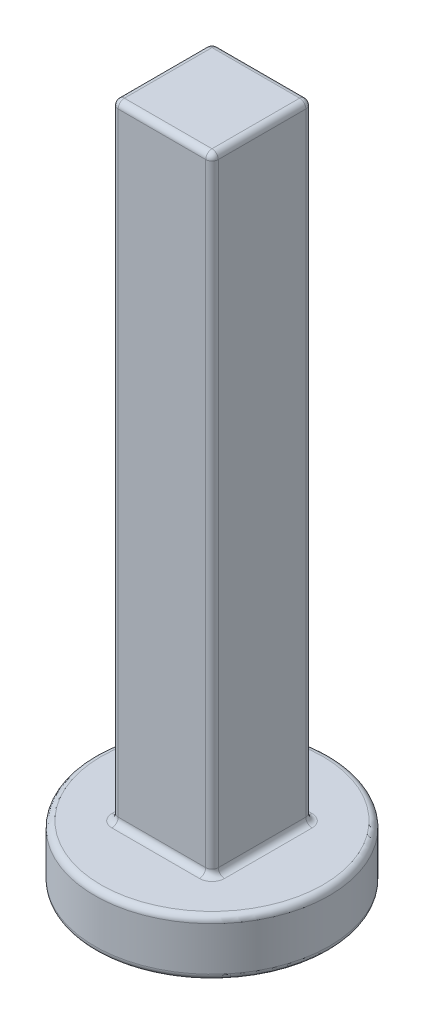
ISO-10303-21;
HEADER;
FILE_DESCRIPTION(('STEP AP214'),'2;1');
FILE_NAME('part.step','',(''),(''),'','','');
FILE_SCHEMA(('AUTOMOTIVE_DESIGN { 1 0 10303 214 1 1 1 1 }'));
ENDSEC;
DATA;
#1=APPLICATION_CONTEXT('core data for automotive mechanical design processes');
#2=APPLICATION_PROTOCOL_DEFINITION('international standard','automotive_design',2000,#1);
#3=PRODUCT_CONTEXT('',#1,'mechanical');
#4=PRODUCT('Part','Part','',(#3));
#5=PRODUCT_RELATED_PRODUCT_CATEGORY('part','',(#4));
#6=PRODUCT_DEFINITION_FORMATION('','',#4);
#7=PRODUCT_DEFINITION_CONTEXT('part definition',#1,'design');
#8=PRODUCT_DEFINITION('design','',#6,#7);
#9=PRODUCT_DEFINITION_SHAPE('','',#8);
#10=(LENGTH_UNIT() NAMED_UNIT(*) SI_UNIT(.MILLI.,.METRE.));
#11=(NAMED_UNIT(*) PLANE_ANGLE_UNIT() SI_UNIT($,.RADIAN.));
#12=(NAMED_UNIT(*) SI_UNIT($,.STERADIAN.) SOLID_ANGLE_UNIT());
#13=UNCERTAINTY_MEASURE_WITH_UNIT(LENGTH_MEASURE(1.E-05),#10,'distance_accuracy_value','');
#14=(GEOMETRIC_REPRESENTATION_CONTEXT(3) GLOBAL_UNCERTAINTY_ASSIGNED_CONTEXT((#13)) GLOBAL_UNIT_ASSIGNED_CONTEXT((#10,
#11,#12)) REPRESENTATION_CONTEXT('',''));
#15=CARTESIAN_POINT('',(0.,0.,0.));
#16=DIRECTION('',(0.,0.,1.));
#17=DIRECTION('',(1.,0.,0.));
#18=AXIS2_PLACEMENT_3D('',#15,#16,#17);
#19=CARTESIAN_POINT('',(0.,1.8,0.));
#20=DIRECTION('',(0.,-1.,0.));
#21=DIRECTION('',(0.,0.,-1.));
#22=AXIS2_PLACEMENT_3D('',#19,#20,#21);
#23=CYLINDRICAL_SURFACE('',#22,3.75);
#24=CARTESIAN_POINT('',(0.,0.2,0.));
#25=DIRECTION('',(0.,1.,0.));
#26=DIRECTION('',(1.,0.,0.));
#27=AXIS2_PLACEMENT_3D('',#24,#25,#26);
#28=CIRCLE('',#27,3.75);
#29=CARTESIAN_POINT('',(3.75,0.2,0.));
#30=VERTEX_POINT('',#29);
#31=EDGE_CURVE('E10',#30,#30,#28,.T.);
#32=ORIENTED_EDGE('',*,*,#31,.T.);
#33=EDGE_LOOP('',(#32));
#34=FACE_BOUND('',#33,.T.);
#35=CARTESIAN_POINT('',(0.,1.6,0.));
#36=DIRECTION('',(0.,-1.,0.));
#37=DIRECTION('',(1.,0.,0.));
#38=AXIS2_PLACEMENT_3D('',#35,#36,#37);
#39=CIRCLE('',#38,3.75);
#40=CARTESIAN_POINT('',(3.75,1.6,0.));
#41=VERTEX_POINT('',#40);
#42=EDGE_CURVE('E26',#41,#41,#39,.T.);
#43=ORIENTED_EDGE('',*,*,#42,.T.);
#44=EDGE_LOOP('',(#43));
#45=FACE_BOUND('',#44,.T.);
#46=ADVANCED_FACE('F16',(#34,#45),#23,.T.);
#47=CARTESIAN_POINT('',(0.,1.8,0.));
#48=DIRECTION('',(0.,1.,0.));
#49=DIRECTION('',(0.,0.,1.));
#50=AXIS2_PLACEMENT_3D('',#47,#48,#49);
#51=PLANE('',#50);
#52=CARTESIAN_POINT('',(0.,1.8,0.));
#53=DIRECTION('',(0.,1.,0.));
#54=DIRECTION('',(1.,0.,0.));
#55=AXIS2_PLACEMENT_3D('',#52,#53,#54);
#56=CIRCLE('',#55,3.55);
#57=CARTESIAN_POINT('',(3.55,1.8,0.));
#58=VERTEX_POINT('',#57);
#59=EDGE_CURVE('E268',#58,#58,#56,.T.);
#60=ORIENTED_EDGE('',*,*,#59,.T.);
#61=EDGE_LOOP('',(#60));
#62=FACE_BOUND('',#61,.T.);
#63=DIRECTION('',(1.,0.,0.));
#64=VECTOR('',#63,1.);
#65=CARTESIAN_POINT('',(0.,1.8,-1.8));
#66=LINE('',#65,#64);
#67=CARTESIAN_POINT('',(-1.4,1.8,-1.8));
#68=VERTEX_POINT('',#67);
#69=CARTESIAN_POINT('',(1.4,1.8,-1.8));
#70=VERTEX_POINT('',#69);
#71=EDGE_CURVE('E188',#68,#70,#66,.T.);
#72=ORIENTED_EDGE('',*,*,#71,.T.);
#73=CARTESIAN_POINT('',(1.4,1.8,-1.4));
#74=DIRECTION('',(0.,-1.,0.));
#75=DIRECTION('',(1.,0.,0.));
#76=AXIS2_PLACEMENT_3D('',#73,#74,#75);
#77=CIRCLE('',#76,0.4);
#78=CARTESIAN_POINT('',(1.8,1.8,-1.4));
#79=VERTEX_POINT('',#78);
#80=EDGE_CURVE('E35',#70,#79,#77,.T.);
#81=ORIENTED_EDGE('',*,*,#80,.T.);
#82=DIRECTION('',(0.,0.,1.));
#83=VECTOR('',#82,1.);
#84=CARTESIAN_POINT('',(1.8,1.8,0.));
#85=LINE('',#84,#83);
#86=CARTESIAN_POINT('',(1.8,1.8,1.4));
#87=VERTEX_POINT('',#86);
#88=EDGE_CURVE('E259',#79,#87,#85,.T.);
#89=ORIENTED_EDGE('',*,*,#88,.T.);
#90=CARTESIAN_POINT('',(1.4,1.8,1.4));
#91=DIRECTION('',(0.,-1.,0.));
#92=DIRECTION('',(1.,0.,0.));
#93=AXIS2_PLACEMENT_3D('',#90,#91,#92);
#94=CIRCLE('',#93,0.4);
#95=CARTESIAN_POINT('',(1.4,1.8,1.8));
#96=VERTEX_POINT('',#95);
#97=EDGE_CURVE('E263',#87,#96,#94,.T.);
#98=ORIENTED_EDGE('',*,*,#97,.T.);
#99=DIRECTION('',(-1.,0.,0.));
#100=VECTOR('',#99,1.);
#101=CARTESIAN_POINT('',(0.,1.8,1.8));
#102=LINE('',#101,#100);
#103=CARTESIAN_POINT('',(-1.4,1.8,1.8));
#104=VERTEX_POINT('',#103);
#105=EDGE_CURVE('E273',#96,#104,#102,.T.);
#106=ORIENTED_EDGE('',*,*,#105,.T.);
#107=CARTESIAN_POINT('',(-1.4,1.8,1.4));
#108=DIRECTION('',(0.,-1.,0.));
#109=DIRECTION('',(1.,0.,0.));
#110=AXIS2_PLACEMENT_3D('',#107,#108,#109);
#111=CIRCLE('',#110,0.4);
#112=CARTESIAN_POINT('',(-1.8,1.8,1.4));
#113=VERTEX_POINT('',#112);
#114=EDGE_CURVE('E276',#104,#113,#111,.T.);
#115=ORIENTED_EDGE('',*,*,#114,.T.);
#116=DIRECTION('',(0.,0.,-1.));
#117=VECTOR('',#116,1.);
#118=CARTESIAN_POINT('',(-1.8,1.8,0.));
#119=LINE('',#118,#117);
#120=CARTESIAN_POINT('',(-1.8,1.8,-1.4));
#121=VERTEX_POINT('',#120);
#122=EDGE_CURVE('E279',#113,#121,#119,.T.);
#123=ORIENTED_EDGE('',*,*,#122,.T.);
#124=CARTESIAN_POINT('',(-1.4,1.8,-1.4));
#125=DIRECTION('',(0.,-1.,0.));
#126=DIRECTION('',(1.,0.,0.));
#127=AXIS2_PLACEMENT_3D('',#124,#125,#126);
#128=CIRCLE('',#127,0.4);
#129=EDGE_CURVE('E282',#121,#68,#128,.T.);
#130=ORIENTED_EDGE('',*,*,#129,.T.);
#131=EDGE_LOOP('',(#72,#81,#89,#98,#106,#115,#123,#130));
#132=FACE_BOUND('',#131,.T.);
#133=ADVANCED_FACE('F265',(#62,#132),#51,.T.);
#134=CARTESIAN_POINT('',(0.,0.,0.));
#135=DIRECTION('',(0.,1.,0.));
#136=DIRECTION('',(0.,0.,1.));
#137=AXIS2_PLACEMENT_3D('',#134,#135,#136);
#138=PLANE('',#137);
#139=CARTESIAN_POINT('',(0.,0.,0.));
#140=DIRECTION('',(0.,-1.,0.));
#141=DIRECTION('',(1.,0.,0.));
#142=AXIS2_PLACEMENT_3D('',#139,#140,#141);
#143=CIRCLE('',#142,3.55);
#144=CARTESIAN_POINT('',(3.55,0.,0.));
#145=VERTEX_POINT('',#144);
#146=EDGE_CURVE('E284',#145,#145,#143,.T.);
#147=ORIENTED_EDGE('',*,*,#146,.T.);
#148=EDGE_LOOP('',(#147));
#149=FACE_BOUND('',#148,.T.);
#150=ADVANCED_FACE('F357',(#149),#138,.F.);
#151=CARTESIAN_POINT('',(-1.4,21.8,1.4));
#152=DIRECTION('',(0.,-1.,0.));
#153=DIRECTION('',(0.,0.,-1.));
#154=AXIS2_PLACEMENT_3D('',#151,#152,#153);
#155=CYLINDRICAL_SURFACE('',#154,0.2);
#156=DIRECTION('',(0.,-1.,0.));
#157=VECTOR('',#156,1.);
#158=CARTESIAN_POINT('',(-1.6,21.8,1.4));
#159=LINE('',#158,#157);
#160=CARTESIAN_POINT('',(-1.6,21.6,1.4));
#161=VERTEX_POINT('',#160);
#162=CARTESIAN_POINT('',(-1.6,2.,1.4));
#163=VERTEX_POINT('',#162);
#164=EDGE_CURVE('E287',#161,#163,#159,.T.);
#165=ORIENTED_EDGE('',*,*,#164,.T.);
#166=CARTESIAN_POINT('',(-1.4,2.,1.4));
#167=DIRECTION('',(0.,1.,0.));
#168=DIRECTION('',(1.,0.,0.));
#169=AXIS2_PLACEMENT_3D('',#166,#167,#168);
#170=CIRCLE('',#169,0.2);
#171=CARTESIAN_POINT('',(-1.4,2.,1.6));
#172=VERTEX_POINT('',#171);
#173=EDGE_CURVE('E290',#163,#172,#170,.T.);
#174=ORIENTED_EDGE('',*,*,#173,.T.);
#175=DIRECTION('',(0.,-1.,0.));
#176=VECTOR('',#175,1.);
#177=CARTESIAN_POINT('',(-1.4,21.8,1.6));
#178=LINE('',#177,#176);
#179=CARTESIAN_POINT('',(-1.4,21.6,1.6));
#180=VERTEX_POINT('',#179);
#181=EDGE_CURVE('E294',#180,#172,#178,.T.);
#182=ORIENTED_EDGE('',*,*,#181,.F.);
#183=CARTESIAN_POINT('',(-1.4,21.6,1.4));
#184=DIRECTION('',(0.,-1.,0.));
#185=DIRECTION('',(0.,0.,-1.));
#186=AXIS2_PLACEMENT_3D('',#183,#184,#185);
#187=CIRCLE('',#186,0.2);
#188=EDGE_CURVE('E293',#180,#161,#187,.T.);
#189=ORIENTED_EDGE('',*,*,#188,.T.);
#190=EDGE_LOOP('',(#165,#174,#182,#189));
#191=FACE_BOUND('',#190,.T.);
#192=ADVANCED_FACE('F338',(#191),#155,.T.);
#193=CARTESIAN_POINT('',(-1.4,21.8,1.6));
#194=DIRECTION('',(0.,0.,-1.));
#195=DIRECTION('',(-1.,0.,0.));
#196=AXIS2_PLACEMENT_3D('',#193,#194,#195);
#197=PLANE('',#196);
#198=ORIENTED_EDGE('',*,*,#181,.T.);
#199=DIRECTION('',(1.,0.,0.));
#200=VECTOR('',#199,1.);
#201=CARTESIAN_POINT('',(-1.4,2.,1.6));
#202=LINE('',#201,#200);
#203=CARTESIAN_POINT('',(1.4,2.,1.6));
#204=VERTEX_POINT('',#203);
#205=EDGE_CURVE('E297',#172,#204,#202,.T.);
#206=ORIENTED_EDGE('',*,*,#205,.T.);
#207=DIRECTION('',(0.,-1.,0.));
#208=VECTOR('',#207,1.);
#209=CARTESIAN_POINT('',(1.4,21.8,1.6));
#210=LINE('',#209,#208);
#211=CARTESIAN_POINT('',(1.4,21.6,1.6));
#212=VERTEX_POINT('',#211);
#213=EDGE_CURVE('E302',#212,#204,#210,.T.);
#214=ORIENTED_EDGE('',*,*,#213,.F.);
#215=DIRECTION('',(-1.,0.,0.));
#216=VECTOR('',#215,1.);
#217=CARTESIAN_POINT('',(-1.4,21.6,1.6));
#218=LINE('',#217,#216);
#219=EDGE_CURVE('E244',#212,#180,#218,.T.);
#220=ORIENTED_EDGE('',*,*,#219,.T.);
#221=EDGE_LOOP('',(#198,#206,#214,#220));
#222=FACE_BOUND('',#221,.T.);
#223=ADVANCED_FACE('F313',(#222),#197,.F.);
#224=CARTESIAN_POINT('',(1.4,21.8,1.4));
#225=DIRECTION('',(0.,-1.,0.));
#226=DIRECTION('',(0.,0.,-1.));
#227=AXIS2_PLACEMENT_3D('',#224,#225,#226);
#228=CYLINDRICAL_SURFACE('',#227,0.2);
#229=ORIENTED_EDGE('',*,*,#213,.T.);
#230=CARTESIAN_POINT('',(1.4,2.,1.4));
#231=DIRECTION('',(0.,1.,0.));
#232=DIRECTION('',(1.,0.,0.));
#233=AXIS2_PLACEMENT_3D('',#230,#231,#232);
#234=CIRCLE('',#233,0.2);
#235=CARTESIAN_POINT('',(1.6,2.,1.4));
#236=VERTEX_POINT('',#235);
#237=EDGE_CURVE('E305',#204,#236,#234,.T.);
#238=ORIENTED_EDGE('',*,*,#237,.T.);
#239=DIRECTION('',(0.,-1.,0.));
#240=VECTOR('',#239,1.);
#241=CARTESIAN_POINT('',(1.6,21.8,1.4));
#242=LINE('',#241,#240);
#243=CARTESIAN_POINT('',(1.6,21.6,1.4));
#244=VERTEX_POINT('',#243);
#245=EDGE_CURVE('E253',#244,#236,#242,.T.);
#246=ORIENTED_EDGE('',*,*,#245,.F.);
#247=CARTESIAN_POINT('',(1.4,21.6,1.4));
#248=DIRECTION('',(0.,-1.,0.));
#249=DIRECTION('',(0.,0.,-1.));
#250=AXIS2_PLACEMENT_3D('',#247,#248,#249);
#251=CIRCLE('',#250,0.2);
#252=EDGE_CURVE('E239',#244,#212,#251,.T.);
#253=ORIENTED_EDGE('',*,*,#252,.T.);
#254=EDGE_LOOP('',(#229,#238,#246,#253));
#255=FACE_BOUND('',#254,.T.);
#256=ADVANCED_FACE('F311',(#255),#228,.T.);
#257=CARTESIAN_POINT('',(1.6,21.8,1.4));
#258=DIRECTION('',(-1.,0.,0.));
#259=DIRECTION('',(0.,0.,1.));
#260=AXIS2_PLACEMENT_3D('',#257,#258,#259);
#261=PLANE('',#260);
#262=ORIENTED_EDGE('',*,*,#245,.T.);
#263=DIRECTION('',(0.,0.,-1.));
#264=VECTOR('',#263,1.);
#265=CARTESIAN_POINT('',(1.6,2.,1.4));
#266=LINE('',#265,#264);
#267=CARTESIAN_POINT('',(1.6,2.,-1.4));
#268=VERTEX_POINT('',#267);
#269=EDGE_CURVE('E249',#236,#268,#266,.T.);
#270=ORIENTED_EDGE('',*,*,#269,.T.);
#271=DIRECTION('',(0.,-1.,0.));
#272=VECTOR('',#271,1.);
#273=CARTESIAN_POINT('',(1.6,21.8,-1.4));
#274=LINE('',#273,#272);
#275=CARTESIAN_POINT('',(1.6,21.6,-1.4));
#276=VERTEX_POINT('',#275);
#277=EDGE_CURVE('E205',#276,#268,#274,.T.);
#278=ORIENTED_EDGE('',*,*,#277,.F.);
#279=DIRECTION('',(0.,0.,1.));
#280=VECTOR('',#279,1.);
#281=CARTESIAN_POINT('',(1.6,21.6,1.4));
#282=LINE('',#281,#280);
#283=EDGE_CURVE('E208',#276,#244,#282,.T.);
#284=ORIENTED_EDGE('',*,*,#283,.T.);
#285=EDGE_LOOP('',(#262,#270,#278,#284));
#286=FACE_BOUND('',#285,.T.);
#287=ADVANCED_FACE('F252',(#286),#261,.F.);
#288=CARTESIAN_POINT('',(1.4,21.8,-1.4));
#289=DIRECTION('',(0.,-1.,0.));
#290=DIRECTION('',(0.,0.,-1.));
#291=AXIS2_PLACEMENT_3D('',#288,#289,#290);
#292=CYLINDRICAL_SURFACE('',#291,0.2);
#293=ORIENTED_EDGE('',*,*,#277,.T.);
#294=CARTESIAN_POINT('',(1.4,2.,-1.4));
#295=DIRECTION('',(0.,1.,0.));
#296=DIRECTION('',(1.,0.,0.));
#297=AXIS2_PLACEMENT_3D('',#294,#295,#296);
#298=CIRCLE('',#297,0.2);
#299=CARTESIAN_POINT('',(1.4,2.,-1.6));
#300=VERTEX_POINT('',#299);
#301=EDGE_CURVE('E184',#268,#300,#298,.T.);
#302=ORIENTED_EDGE('',*,*,#301,.T.);
#303=DIRECTION('',(0.,-1.,0.));
#304=VECTOR('',#303,1.);
#305=CARTESIAN_POINT('',(1.4,21.8,-1.6));
#306=LINE('',#305,#304);
#307=CARTESIAN_POINT('',(1.4,21.6,-1.6));
#308=VERTEX_POINT('',#307);
#309=EDGE_CURVE('E195',#308,#300,#306,.T.);
#310=ORIENTED_EDGE('',*,*,#309,.F.);
#311=CARTESIAN_POINT('',(1.4,21.6,-1.4));
#312=DIRECTION('',(0.,-1.,0.));
#313=DIRECTION('',(0.,0.,-1.));
#314=AXIS2_PLACEMENT_3D('',#311,#312,#313);
#315=CIRCLE('',#314,0.2);
#316=EDGE_CURVE('E201',#308,#276,#315,.T.);
#317=ORIENTED_EDGE('',*,*,#316,.T.);
#318=EDGE_LOOP('',(#293,#302,#310,#317));
#319=FACE_BOUND('',#318,.T.);
#320=ADVANCED_FACE('F203',(#319),#292,.T.);
#321=CARTESIAN_POINT('',(1.4,21.8,-1.6));
#322=DIRECTION('',(0.,0.,1.));
#323=DIRECTION('',(1.,0.,0.));
#324=AXIS2_PLACEMENT_3D('',#321,#322,#323);
#325=PLANE('',#324);
#326=ORIENTED_EDGE('',*,*,#309,.T.);
#327=DIRECTION('',(-1.,0.,0.));
#328=VECTOR('',#327,1.);
#329=CARTESIAN_POINT('',(1.4,2.,-1.6));
#330=LINE('',#329,#328);
#331=CARTESIAN_POINT('',(-1.4,2.,-1.6));
#332=VERTEX_POINT('',#331);
#333=EDGE_CURVE('E191',#300,#332,#330,.T.);
#334=ORIENTED_EDGE('',*,*,#333,.T.);
#335=DIRECTION('',(0.,-1.,0.));
#336=VECTOR('',#335,1.);
#337=CARTESIAN_POINT('',(-1.4,21.8,-1.6));
#338=LINE('',#337,#336);
#339=CARTESIAN_POINT('',(-1.4,21.6,-1.6));
#340=VERTEX_POINT('',#339);
#341=EDGE_CURVE('E213',#340,#332,#338,.T.);
#342=ORIENTED_EDGE('',*,*,#341,.F.);
#343=DIRECTION('',(1.,0.,0.));
#344=VECTOR('',#343,1.);
#345=CARTESIAN_POINT('',(1.4,21.6,-1.6));
#346=LINE('',#345,#344);
#347=EDGE_CURVE('E154',#340,#308,#346,.T.);
#348=ORIENTED_EDGE('',*,*,#347,.T.);
#349=EDGE_LOOP('',(#326,#334,#342,#348));
#350=FACE_BOUND('',#349,.T.);
#351=ADVANCED_FACE('F198',(#350),#325,.F.);
#352=CARTESIAN_POINT('',(-1.4,21.8,-1.4));
#353=DIRECTION('',(0.,-1.,0.));
#354=DIRECTION('',(0.,0.,-1.));
#355=AXIS2_PLACEMENT_3D('',#352,#353,#354);
#356=CYLINDRICAL_SURFACE('',#355,0.2);
#357=ORIENTED_EDGE('',*,*,#341,.T.);
#358=CARTESIAN_POINT('',(-1.4,2.,-1.4));
#359=DIRECTION('',(0.,1.,0.));
#360=DIRECTION('',(1.,0.,0.));
#361=AXIS2_PLACEMENT_3D('',#358,#359,#360);
#362=CIRCLE('',#361,0.2);
#363=CARTESIAN_POINT('',(-1.6,2.,-1.4));
#364=VERTEX_POINT('',#363);
#365=EDGE_CURVE('E216',#332,#364,#362,.T.);
#366=ORIENTED_EDGE('',*,*,#365,.T.);
#367=DIRECTION('',(0.,-1.,0.));
#368=VECTOR('',#367,1.);
#369=CARTESIAN_POINT('',(-1.6,21.8,-1.4));
#370=LINE('',#369,#368);
#371=CARTESIAN_POINT('',(-1.6,21.6,-1.4));
#372=VERTEX_POINT('',#371);
#373=EDGE_CURVE('E220',#372,#364,#370,.T.);
#374=ORIENTED_EDGE('',*,*,#373,.F.);
#375=CARTESIAN_POINT('',(-1.4,21.6,-1.4));
#376=DIRECTION('',(0.,-1.,0.));
#377=DIRECTION('',(0.,0.,-1.));
#378=AXIS2_PLACEMENT_3D('',#375,#376,#377);
#379=CIRCLE('',#378,0.2);
#380=EDGE_CURVE('E128',#372,#340,#379,.T.);
#381=ORIENTED_EDGE('',*,*,#380,.T.);
#382=EDGE_LOOP('',(#357,#366,#374,#381));
#383=FACE_BOUND('',#382,.T.);
#384=ADVANCED_FACE('F332',(#383),#356,.T.);
#385=CARTESIAN_POINT('',(-1.6,21.8,-1.4));
#386=DIRECTION('',(1.,0.,0.));
#387=DIRECTION('',(0.,0.,-1.));
#388=AXIS2_PLACEMENT_3D('',#385,#386,#387);
#389=PLANE('',#388);
#390=ORIENTED_EDGE('',*,*,#373,.T.);
#391=DIRECTION('',(0.,0.,1.));
#392=VECTOR('',#391,1.);
#393=CARTESIAN_POINT('',(-1.6,2.,-1.4));
#394=LINE('',#393,#392);
#395=EDGE_CURVE('E223',#364,#163,#394,.T.);
#396=ORIENTED_EDGE('',*,*,#395,.T.);
#397=ORIENTED_EDGE('',*,*,#164,.F.);
#398=DIRECTION('',(0.,0.,-1.));
#399=VECTOR('',#398,1.);
#400=CARTESIAN_POINT('',(-1.6,21.6,-1.4));
#401=LINE('',#400,#399);
#402=EDGE_CURVE('E226',#161,#372,#401,.T.);
#403=ORIENTED_EDGE('',*,*,#402,.T.);
#404=EDGE_LOOP('',(#390,#396,#397,#403));
#405=FACE_BOUND('',#404,.T.);
#406=ADVANCED_FACE('F334',(#405),#389,.F.);
#407=CARTESIAN_POINT('',(-1.4,21.8,1.4));
#408=DIRECTION('',(0.,1.,0.));
#409=DIRECTION('',(-1.,0.,0.));
#410=AXIS2_PLACEMENT_3D('',#407,#408,#409);
#411=PLANE('',#410);
#412=DIRECTION('',(1.,0.,0.));
#413=VECTOR('',#412,1.);
#414=CARTESIAN_POINT('',(1.4,21.8,1.4));
#415=LINE('',#414,#413);
#416=CARTESIAN_POINT('',(-1.4,21.8,1.4));
#417=VERTEX_POINT('',#416);
#418=CARTESIAN_POINT('',(1.4,21.8,1.4));
#419=VERTEX_POINT('',#418);
#420=EDGE_CURVE('E228',#417,#419,#415,.T.);
#421=ORIENTED_EDGE('',*,*,#420,.T.);
#422=DIRECTION('',(0.,0.,-1.));
#423=VECTOR('',#422,1.);
#424=CARTESIAN_POINT('',(1.4,21.8,-1.4));
#425=LINE('',#424,#423);
#426=CARTESIAN_POINT('',(1.4,21.8,-1.4));
#427=VERTEX_POINT('',#426);
#428=EDGE_CURVE('E147',#419,#427,#425,.T.);
#429=ORIENTED_EDGE('',*,*,#428,.T.);
#430=DIRECTION('',(-1.,0.,0.));
#431=VECTOR('',#430,1.);
#432=CARTESIAN_POINT('',(-1.4,21.8,-1.4));
#433=LINE('',#432,#431);
#434=CARTESIAN_POINT('',(-1.4,21.8,-1.4));
#435=VERTEX_POINT('',#434);
#436=EDGE_CURVE('E142',#427,#435,#433,.T.);
#437=ORIENTED_EDGE('',*,*,#436,.T.);
#438=DIRECTION('',(0.,0.,1.));
#439=VECTOR('',#438,1.);
#440=CARTESIAN_POINT('',(-1.4,21.8,1.4));
#441=LINE('',#440,#439);
#442=EDGE_CURVE('E134',#435,#417,#441,.T.);
#443=ORIENTED_EDGE('',*,*,#442,.T.);
#444=EDGE_LOOP('',(#421,#429,#437,#443));
#445=FACE_BOUND('',#444,.T.);
#446=ADVANCED_FACE('F146',(#445),#411,.T.);
#447=CARTESIAN_POINT('',(-1.4,21.6,1.4));
#448=DIRECTION('',(0.,1.,0.));
#449=DIRECTION('',(-1.,0.,0.));
#450=AXIS2_PLACEMENT_3D('',#447,#448,#449);
#451=SPHERICAL_SURFACE('',#450,0.2);
#452=CARTESIAN_POINT('',(-1.4,21.6,1.4));
#453=DIRECTION('',(0.,0.,-1.));
#454=DIRECTION('',(0.,-1.,0.));
#455=AXIS2_PLACEMENT_3D('',#452,#453,#454);
#456=CIRCLE('',#455,0.2);
#457=EDGE_CURVE('E138',#161,#417,#456,.T.);
#458=ORIENTED_EDGE('',*,*,#457,.F.);
#459=ORIENTED_EDGE('',*,*,#188,.F.);
#460=CARTESIAN_POINT('',(-1.4,21.6,1.4));
#461=DIRECTION('',(1.,0.,0.));
#462=DIRECTION('',(0.,1.,0.));
#463=AXIS2_PLACEMENT_3D('',#460,#461,#462);
#464=CIRCLE('',#463,0.2);
#465=EDGE_CURVE('E143',#417,#180,#464,.T.);
#466=ORIENTED_EDGE('',*,*,#465,.F.);
#467=EDGE_LOOP('',(#458,#459,#466));
#468=FACE_BOUND('',#467,.T.);
#469=ADVANCED_FACE('F340',(#468),#451,.T.);
#470=CARTESIAN_POINT('',(-1.4,21.6,1.4));
#471=DIRECTION('',(-1.,0.,0.));
#472=DIRECTION('',(0.,1.,0.));
#473=AXIS2_PLACEMENT_3D('',#470,#471,#472);
#474=CYLINDRICAL_SURFACE('',#473,0.2);
#475=ORIENTED_EDGE('',*,*,#465,.T.);
#476=ORIENTED_EDGE('',*,*,#219,.F.);
#477=CARTESIAN_POINT('',(1.4,21.6,1.4));
#478=DIRECTION('',(1.,0.,0.));
#479=DIRECTION('',(0.,1.,0.));
#480=AXIS2_PLACEMENT_3D('',#477,#478,#479);
#481=CIRCLE('',#480,0.2);
#482=EDGE_CURVE('E130',#419,#212,#481,.T.);
#483=ORIENTED_EDGE('',*,*,#482,.F.);
#484=ORIENTED_EDGE('',*,*,#420,.F.);
#485=EDGE_LOOP('',(#475,#476,#483,#484));
#486=FACE_BOUND('',#485,.T.);
#487=ADVANCED_FACE('F242',(#486),#474,.T.);
#488=CARTESIAN_POINT('',(-1.4,21.6,1.4));
#489=DIRECTION('',(0.,0.,-1.));
#490=DIRECTION('',(0.,-1.,0.));
#491=AXIS2_PLACEMENT_3D('',#488,#489,#490);
#492=CYLINDRICAL_SURFACE('',#491,0.2);
#493=ORIENTED_EDGE('',*,*,#457,.T.);
#494=ORIENTED_EDGE('',*,*,#442,.F.);
#495=CARTESIAN_POINT('',(-1.4,21.6,-1.4));
#496=DIRECTION('',(0.,0.,-1.));
#497=DIRECTION('',(0.,-1.,0.));
#498=AXIS2_PLACEMENT_3D('',#495,#496,#497);
#499=CIRCLE('',#498,0.2);
#500=EDGE_CURVE('E123',#372,#435,#499,.T.);
#501=ORIENTED_EDGE('',*,*,#500,.F.);
#502=ORIENTED_EDGE('',*,*,#402,.F.);
#503=EDGE_LOOP('',(#493,#494,#501,#502));
#504=FACE_BOUND('',#503,.T.);
#505=ADVANCED_FACE('F136',(#504),#492,.T.);
#506=CARTESIAN_POINT('',(1.4,21.6,1.4));
#507=DIRECTION('',(0.,1.,0.));
#508=DIRECTION('',(-1.,0.,0.));
#509=AXIS2_PLACEMENT_3D('',#506,#507,#508);
#510=SPHERICAL_SURFACE('',#509,0.2);
#511=ORIENTED_EDGE('',*,*,#482,.T.);
#512=ORIENTED_EDGE('',*,*,#252,.F.);
#513=CARTESIAN_POINT('',(1.4,21.6,1.4));
#514=DIRECTION('',(0.,0.,-1.));
#515=DIRECTION('',(0.,-1.,0.));
#516=AXIS2_PLACEMENT_3D('',#513,#514,#515);
#517=CIRCLE('',#516,0.2);
#518=EDGE_CURVE('E131',#419,#244,#517,.T.);
#519=ORIENTED_EDGE('',*,*,#518,.F.);
#520=EDGE_LOOP('',(#511,#512,#519));
#521=FACE_BOUND('',#520,.T.);
#522=ADVANCED_FACE('F238',(#521),#510,.T.);
#523=CARTESIAN_POINT('',(-1.4,21.6,-1.4));
#524=DIRECTION('',(0.,1.,0.));
#525=DIRECTION('',(-1.,0.,0.));
#526=AXIS2_PLACEMENT_3D('',#523,#524,#525);
#527=SPHERICAL_SURFACE('',#526,0.2);
#528=ORIENTED_EDGE('',*,*,#380,.F.);
#529=ORIENTED_EDGE('',*,*,#500,.T.);
#530=CARTESIAN_POINT('',(-1.4,21.6,-1.4));
#531=DIRECTION('',(1.,0.,0.));
#532=DIRECTION('',(0.,1.,0.));
#533=AXIS2_PLACEMENT_3D('',#530,#531,#532);
#534=CIRCLE('',#533,0.2);
#535=EDGE_CURVE('E127',#340,#435,#534,.T.);
#536=ORIENTED_EDGE('',*,*,#535,.F.);
#537=EDGE_LOOP('',(#528,#529,#536));
#538=FACE_BOUND('',#537,.T.);
#539=ADVANCED_FACE('F125',(#538),#527,.T.);
#540=CARTESIAN_POINT('',(1.4,21.6,1.4));
#541=DIRECTION('',(0.,0.,1.));
#542=DIRECTION('',(1.,0.,0.));
#543=AXIS2_PLACEMENT_3D('',#540,#541,#542);
#544=CYLINDRICAL_SURFACE('',#543,0.2);
#545=ORIENTED_EDGE('',*,*,#518,.T.);
#546=ORIENTED_EDGE('',*,*,#283,.F.);
#547=CARTESIAN_POINT('',(1.4,21.6,-1.4));
#548=DIRECTION('',(0.,0.,-1.));
#549=DIRECTION('',(0.,-1.,0.));
#550=AXIS2_PLACEMENT_3D('',#547,#548,#549);
#551=CIRCLE('',#550,0.2);
#552=EDGE_CURVE('E116',#427,#276,#551,.T.);
#553=ORIENTED_EDGE('',*,*,#552,.F.);
#554=ORIENTED_EDGE('',*,*,#428,.F.);
#555=EDGE_LOOP('',(#545,#546,#553,#554));
#556=FACE_BOUND('',#555,.T.);
#557=ADVANCED_FACE('F245',(#556),#544,.T.);
#558=CARTESIAN_POINT('',(-1.4,21.6,-1.4));
#559=DIRECTION('',(1.,0.,0.));
#560=DIRECTION('',(0.,1.,0.));
#561=AXIS2_PLACEMENT_3D('',#558,#559,#560);
#562=CYLINDRICAL_SURFACE('',#561,0.2);
#563=ORIENTED_EDGE('',*,*,#535,.T.);
#564=ORIENTED_EDGE('',*,*,#436,.F.);
#565=CARTESIAN_POINT('',(1.4,21.6,-1.4));
#566=DIRECTION('',(1.,0.,0.));
#567=DIRECTION('',(0.,1.,0.));
#568=AXIS2_PLACEMENT_3D('',#565,#566,#567);
#569=CIRCLE('',#568,0.2);
#570=EDGE_CURVE('E158',#308,#427,#569,.T.);
#571=ORIENTED_EDGE('',*,*,#570,.F.);
#572=ORIENTED_EDGE('',*,*,#347,.F.);
#573=EDGE_LOOP('',(#563,#564,#571,#572));
#574=FACE_BOUND('',#573,.T.);
#575=ADVANCED_FACE('F153',(#574),#562,.T.);
#576=CARTESIAN_POINT('',(1.4,21.6,-1.4));
#577=DIRECTION('',(0.,1.,0.));
#578=DIRECTION('',(-1.,0.,0.));
#579=AXIS2_PLACEMENT_3D('',#576,#577,#578);
#580=SPHERICAL_SURFACE('',#579,0.2);
#581=ORIENTED_EDGE('',*,*,#552,.T.);
#582=ORIENTED_EDGE('',*,*,#316,.F.);
#583=ORIENTED_EDGE('',*,*,#570,.T.);
#584=EDGE_LOOP('',(#581,#582,#583));
#585=FACE_BOUND('',#584,.T.);
#586=ADVANCED_FACE('F251',(#585),#580,.T.);
#587=CARTESIAN_POINT('',(-1.4,2.,1.4));
#588=DIRECTION('',(0.,1.,0.));
#589=DIRECTION('',(1.,0.,0.));
#590=AXIS2_PLACEMENT_3D('',#587,#588,#589);
#591=TOROIDAL_SURFACE('',#590,0.4,0.2);
#592=CARTESIAN_POINT('',(-1.8,2.,1.4));
#593=DIRECTION('',(0.,0.,1.));
#594=DIRECTION('',(1.,0.,0.));
#595=AXIS2_PLACEMENT_3D('',#592,#593,#594);
#596=CIRCLE('',#595,0.2);
#597=EDGE_CURVE('E163',#113,#163,#596,.T.);
#598=ORIENTED_EDGE('',*,*,#597,.F.);
#599=ORIENTED_EDGE('',*,*,#114,.F.);
#600=CARTESIAN_POINT('',(-1.4,2.,1.8));
#601=DIRECTION('',(-1.,0.,0.));
#602=DIRECTION('',(0.,0.,1.));
#603=AXIS2_PLACEMENT_3D('',#600,#601,#602);
#604=CIRCLE('',#603,0.2);
#605=EDGE_CURVE('E162',#172,#104,#604,.T.);
#606=ORIENTED_EDGE('',*,*,#605,.F.);
#607=ORIENTED_EDGE('',*,*,#173,.F.);
#608=EDGE_LOOP('',(#598,#599,#606,#607));
#609=FACE_BOUND('',#608,.T.);
#610=ADVANCED_FACE('F324',(#609),#591,.F.);
#611=CARTESIAN_POINT('',(-1.4,2.,1.8));
#612=DIRECTION('',(1.,0.,0.));
#613=DIRECTION('',(0.,1.,0.));
#614=AXIS2_PLACEMENT_3D('',#611,#612,#613);
#615=CYLINDRICAL_SURFACE('',#614,0.2);
#616=ORIENTED_EDGE('',*,*,#605,.T.);
#617=ORIENTED_EDGE('',*,*,#105,.F.);
#618=CARTESIAN_POINT('',(1.4,2.,1.8));
#619=DIRECTION('',(-1.,0.,0.));
#620=DIRECTION('',(0.,0.,1.));
#621=AXIS2_PLACEMENT_3D('',#618,#619,#620);
#622=CIRCLE('',#621,0.2);
#623=EDGE_CURVE('E166',#204,#96,#622,.T.);
#624=ORIENTED_EDGE('',*,*,#623,.F.);
#625=ORIENTED_EDGE('',*,*,#205,.F.);
#626=EDGE_LOOP('',(#616,#617,#624,#625));
#627=FACE_BOUND('',#626,.T.);
#628=ADVANCED_FACE('F317',(#627),#615,.F.);
#629=CARTESIAN_POINT('',(-1.8,2.,-1.4));
#630=DIRECTION('',(0.,0.,1.));
#631=DIRECTION('',(1.,0.,0.));
#632=AXIS2_PLACEMENT_3D('',#629,#630,#631);
#633=CYLINDRICAL_SURFACE('',#632,0.2);
#634=ORIENTED_EDGE('',*,*,#597,.T.);
#635=ORIENTED_EDGE('',*,*,#395,.F.);
#636=CARTESIAN_POINT('',(-1.8,2.,-1.4));
#637=DIRECTION('',(0.,0.,1.));
#638=DIRECTION('',(1.,0.,0.));
#639=AXIS2_PLACEMENT_3D('',#636,#637,#638);
#640=CIRCLE('',#639,0.2);
#641=EDGE_CURVE('E171',#121,#364,#640,.T.);
#642=ORIENTED_EDGE('',*,*,#641,.F.);
#643=ORIENTED_EDGE('',*,*,#122,.F.);
#644=EDGE_LOOP('',(#634,#635,#642,#643));
#645=FACE_BOUND('',#644,.T.);
#646=ADVANCED_FACE('F326',(#645),#633,.F.);
#647=CARTESIAN_POINT('',(1.4,2.,1.4));
#648=DIRECTION('',(0.,1.,0.));
#649=DIRECTION('',(1.,0.,0.));
#650=AXIS2_PLACEMENT_3D('',#647,#648,#649);
#651=TOROIDAL_SURFACE('',#650,0.4,0.2);
#652=ORIENTED_EDGE('',*,*,#623,.T.);
#653=ORIENTED_EDGE('',*,*,#97,.F.);
#654=CARTESIAN_POINT('',(1.8,2.,1.4));
#655=DIRECTION('',(0.,0.,1.));
#656=DIRECTION('',(1.,0.,0.));
#657=AXIS2_PLACEMENT_3D('',#654,#655,#656);
#658=CIRCLE('',#657,0.2);
#659=EDGE_CURVE('E174',#236,#87,#658,.T.);
#660=ORIENTED_EDGE('',*,*,#659,.F.);
#661=ORIENTED_EDGE('',*,*,#237,.F.);
#662=EDGE_LOOP('',(#652,#653,#660,#661));
#663=FACE_BOUND('',#662,.T.);
#664=ADVANCED_FACE('F319',(#663),#651,.F.);
#665=CARTESIAN_POINT('',(-1.4,2.,-1.4));
#666=DIRECTION('',(0.,1.,0.));
#667=DIRECTION('',(1.,0.,0.));
#668=AXIS2_PLACEMENT_3D('',#665,#666,#667);
#669=TOROIDAL_SURFACE('',#668,0.4,0.2);
#670=ORIENTED_EDGE('',*,*,#641,.T.);
#671=ORIENTED_EDGE('',*,*,#365,.F.);
#672=CARTESIAN_POINT('',(-1.4,2.,-1.8));
#673=DIRECTION('',(-1.,0.,0.));
#674=DIRECTION('',(0.,0.,1.));
#675=AXIS2_PLACEMENT_3D('',#672,#673,#674);
#676=CIRCLE('',#675,0.2);
#677=EDGE_CURVE('E177',#68,#332,#676,.T.);
#678=ORIENTED_EDGE('',*,*,#677,.F.);
#679=ORIENTED_EDGE('',*,*,#129,.F.);
#680=EDGE_LOOP('',(#670,#671,#678,#679));
#681=FACE_BOUND('',#680,.T.);
#682=ADVANCED_FACE('F329',(#681),#669,.F.);
#683=CARTESIAN_POINT('',(1.8,2.,1.4));
#684=DIRECTION('',(0.,0.,-1.));
#685=DIRECTION('',(0.,-1.,0.));
#686=AXIS2_PLACEMENT_3D('',#683,#684,#685);
#687=CYLINDRICAL_SURFACE('',#686,0.2);
#688=ORIENTED_EDGE('',*,*,#659,.T.);
#689=ORIENTED_EDGE('',*,*,#88,.F.);
#690=CARTESIAN_POINT('',(1.8,2.,-1.4));
#691=DIRECTION('',(0.,0.,1.));
#692=DIRECTION('',(1.,0.,0.));
#693=AXIS2_PLACEMENT_3D('',#690,#691,#692);
#694=CIRCLE('',#693,0.2);
#695=EDGE_CURVE('E179',#268,#79,#694,.T.);
#696=ORIENTED_EDGE('',*,*,#695,.F.);
#697=ORIENTED_EDGE('',*,*,#269,.F.);
#698=EDGE_LOOP('',(#688,#689,#696,#697));
#699=FACE_BOUND('',#698,.T.);
#700=ADVANCED_FACE('F257',(#699),#687,.F.);
#701=CARTESIAN_POINT('',(1.4,2.,-1.8));
#702=DIRECTION('',(-1.,0.,0.));
#703=DIRECTION('',(0.,0.,1.));
#704=AXIS2_PLACEMENT_3D('',#701,#702,#703);
#705=CYLINDRICAL_SURFACE('',#704,0.2);
#706=ORIENTED_EDGE('',*,*,#677,.T.);
#707=ORIENTED_EDGE('',*,*,#333,.F.);
#708=CARTESIAN_POINT('',(1.4,2.,-1.8));
#709=DIRECTION('',(-1.,0.,0.));
#710=DIRECTION('',(0.,0.,1.));
#711=AXIS2_PLACEMENT_3D('',#708,#709,#710);
#712=CIRCLE('',#711,0.2);
#713=EDGE_CURVE('E20',#70,#300,#712,.T.);
#714=ORIENTED_EDGE('',*,*,#713,.F.);
#715=ORIENTED_EDGE('',*,*,#71,.F.);
#716=EDGE_LOOP('',(#706,#707,#714,#715));
#717=FACE_BOUND('',#716,.T.);
#718=ADVANCED_FACE('F18',(#717),#705,.F.);
#719=CARTESIAN_POINT('',(1.4,2.,-1.4));
#720=DIRECTION('',(0.,1.,0.));
#721=DIRECTION('',(1.,0.,0.));
#722=AXIS2_PLACEMENT_3D('',#719,#720,#721);
#723=TOROIDAL_SURFACE('',#722,0.4,0.2);
#724=ORIENTED_EDGE('',*,*,#695,.T.);
#725=ORIENTED_EDGE('',*,*,#80,.F.);
#726=ORIENTED_EDGE('',*,*,#713,.T.);
#727=ORIENTED_EDGE('',*,*,#301,.F.);
#728=EDGE_LOOP('',(#724,#725,#726,#727));
#729=FACE_BOUND('',#728,.T.);
#730=ADVANCED_FACE('F182',(#729),#723,.F.);
#731=CARTESIAN_POINT('',(0.,1.6,0.));
#732=DIRECTION('',(0.,1.,0.));
#733=DIRECTION('',(1.,0.,0.));
#734=AXIS2_PLACEMENT_3D('',#731,#732,#733);
#735=TOROIDAL_SURFACE('',#734,3.55,0.2);
#736=ORIENTED_EDGE('',*,*,#42,.F.);
#737=EDGE_LOOP('',(#736));
#738=FACE_BOUND('',#737,.T.);
#739=ORIENTED_EDGE('',*,*,#59,.F.);
#740=EDGE_LOOP('',(#739));
#741=FACE_BOUND('',#740,.T.);
#742=ADVANCED_FACE('F395',(#738,#741),#735,.T.);
#743=CARTESIAN_POINT('',(0.,0.2,0.));
#744=DIRECTION('',(0.,1.,0.));
#745=DIRECTION('',(1.,0.,0.));
#746=AXIS2_PLACEMENT_3D('',#743,#744,#745);
#747=TOROIDAL_SURFACE('',#746,3.55,0.2);
#748=ORIENTED_EDGE('',*,*,#146,.F.);
#749=EDGE_LOOP('',(#748));
#750=FACE_BOUND('',#749,.T.);
#751=ORIENTED_EDGE('',*,*,#31,.F.);
#752=EDGE_LOOP('',(#751));
#753=FACE_BOUND('',#752,.T.);
#754=ADVANCED_FACE('F363',(#750,#753),#747,.T.);
#755=CLOSED_SHELL('',(#46,#133,#150,#192,#223,#256,#287,#320,#351,#384,#406,#446,#469,#487,#505,
#522,#539,#557,#575,#586,#610,#628,#646,#664,#682,#700,#718,#730,#742,#754));
#756=MANIFOLD_SOLID_BREP('B1',#755);
#757=ADVANCED_BREP_SHAPE_REPRESENTATION('',(#18,#756),#14);
#758=SHAPE_DEFINITION_REPRESENTATION(#9,#757);
ENDSEC;
END-ISO-10303-21;
